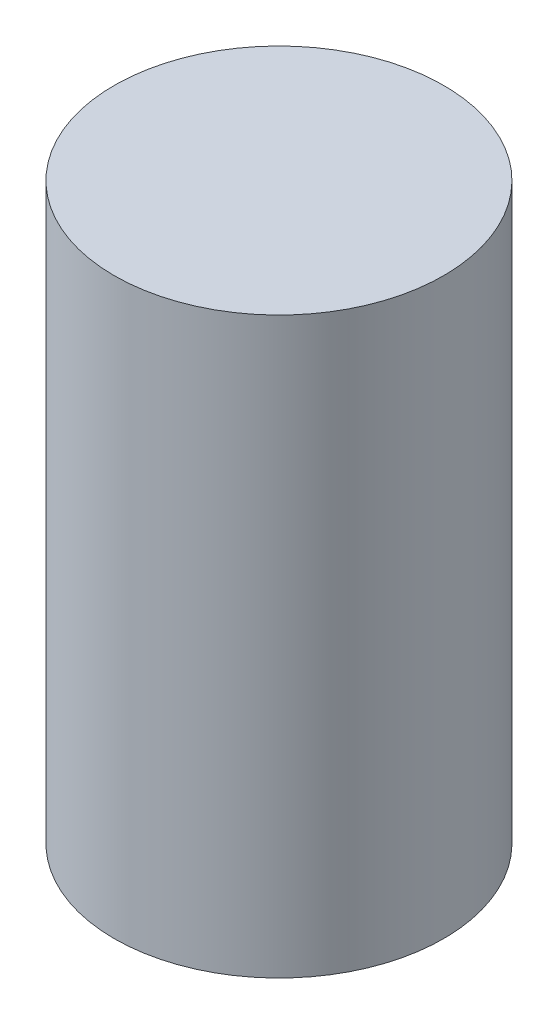
ISO-10303-21;
HEADER;
FILE_DESCRIPTION(('STEP AP214'),'2;1');
FILE_NAME('part.step','',(''),(''),'','','');
FILE_SCHEMA(('AUTOMOTIVE_DESIGN { 1 0 10303 214 1 1 1 1 }'));
ENDSEC;
DATA;
#1=APPLICATION_CONTEXT('core data for automotive mechanical design processes');
#2=APPLICATION_PROTOCOL_DEFINITION('international standard','automotive_design',2000,#1);
#3=PRODUCT_CONTEXT('',#1,'mechanical');
#4=PRODUCT('Part','Part','',(#3));
#5=PRODUCT_RELATED_PRODUCT_CATEGORY('part','',(#4));
#6=PRODUCT_DEFINITION_FORMATION('','',#4);
#7=PRODUCT_DEFINITION_CONTEXT('part definition',#1,'design');
#8=PRODUCT_DEFINITION('design','',#6,#7);
#9=PRODUCT_DEFINITION_SHAPE('','',#8);
#10=(LENGTH_UNIT() NAMED_UNIT(*) SI_UNIT(.MILLI.,.METRE.));
#11=(NAMED_UNIT(*) PLANE_ANGLE_UNIT() SI_UNIT($,.RADIAN.));
#12=(NAMED_UNIT(*) SI_UNIT($,.STERADIAN.) SOLID_ANGLE_UNIT());
#13=UNCERTAINTY_MEASURE_WITH_UNIT(LENGTH_MEASURE(1.E-05),#10,'distance_accuracy_value','');
#14=(GEOMETRIC_REPRESENTATION_CONTEXT(3) GLOBAL_UNCERTAINTY_ASSIGNED_CONTEXT((#13)) GLOBAL_UNIT_ASSIGNED_CONTEXT((#10,
#11,#12)) REPRESENTATION_CONTEXT('',''));
#15=CARTESIAN_POINT('',(0.,0.,0.));
#16=DIRECTION('',(0.,0.,1.));
#17=DIRECTION('',(1.,0.,0.));
#18=AXIS2_PLACEMENT_3D('',#15,#16,#17);
#19=CARTESIAN_POINT('',(0.,23.,0.));
#20=DIRECTION('',(0.,-1.,0.));
#21=DIRECTION('',(0.,0.,-1.));
#22=AXIS2_PLACEMENT_3D('',#19,#20,#21);
#23=CYLINDRICAL_SURFACE('',#22,6.6);
#24=CARTESIAN_POINT('',(0.,23.,0.));
#25=DIRECTION('',(0.,1.,0.));
#26=DIRECTION('',(0.,0.,1.));
#27=AXIS2_PLACEMENT_3D('',#24,#25,#26);
#28=CIRCLE('',#27,6.6);
#29=CARTESIAN_POINT('',(0.,23.,6.6));
#30=VERTEX_POINT('',#29);
#31=EDGE_CURVE('E10',#30,#30,#28,.T.);
#32=ORIENTED_EDGE('',*,*,#31,.F.);
#33=EDGE_LOOP('',(#32));
#34=FACE_BOUND('',#33,.T.);
#35=CARTESIAN_POINT('',(0.,0.,0.));
#36=DIRECTION('',(0.,1.,0.));
#37=DIRECTION('',(0.,0.,1.));
#38=AXIS2_PLACEMENT_3D('',#35,#36,#37);
#39=CIRCLE('',#38,6.6);
#40=CARTESIAN_POINT('',(0.,0.,6.6));
#41=VERTEX_POINT('',#40);
#42=EDGE_CURVE('E40',#41,#41,#39,.T.);
#43=ORIENTED_EDGE('',*,*,#42,.T.);
#44=EDGE_LOOP('',(#43));
#45=FACE_BOUND('',#44,.T.);
#46=ADVANCED_FACE('F37',(#34,#45),#23,.T.);
#47=CARTESIAN_POINT('',(0.,23.,0.));
#48=DIRECTION('',(0.,1.,0.));
#49=DIRECTION('',(0.,0.,1.));
#50=AXIS2_PLACEMENT_3D('',#47,#48,#49);
#51=PLANE('',#50);
#52=ORIENTED_EDGE('',*,*,#31,.T.);
#53=EDGE_LOOP('',(#52));
#54=FACE_BOUND('',#53,.T.);
#55=ADVANCED_FACE('F54',(#54),#51,.T.);
#56=CARTESIAN_POINT('',(0.,0.,0.));
#57=DIRECTION('',(0.,1.,0.));
#58=DIRECTION('',(0.,0.,1.));
#59=AXIS2_PLACEMENT_3D('',#56,#57,#58);
#60=PLANE('',#59);
#61=ORIENTED_EDGE('',*,*,#42,.F.);
#62=EDGE_LOOP('',(#61));
#63=FACE_BOUND('',#62,.T.);
#64=ADVANCED_FACE('F52',(#63),#60,.F.);
#65=CLOSED_SHELL('',(#46,#55,#64));
#66=MANIFOLD_SOLID_BREP('B2',#65);
#67=ADVANCED_BREP_SHAPE_REPRESENTATION('',(#18,#66),#14);
#68=SHAPE_DEFINITION_REPRESENTATION(#9,#67);
ENDSEC;
END-ISO-10303-21;
